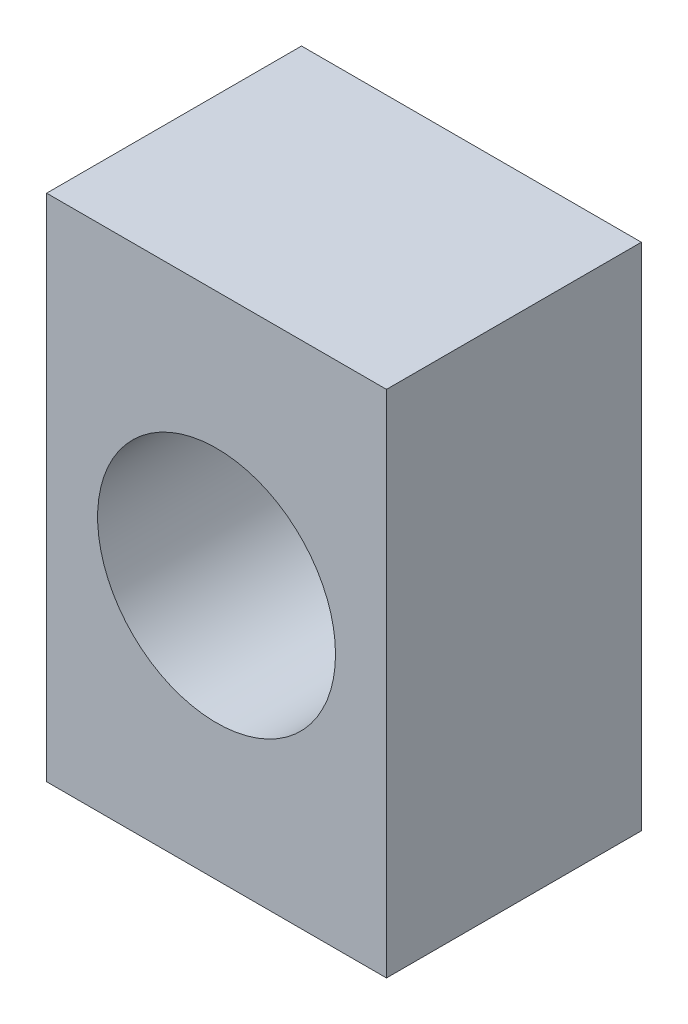
ISO-10303-21;
HEADER;
FILE_DESCRIPTION(('STEP AP214'),'2;1');
FILE_NAME('part.step','',(''),(''),'','','');
FILE_SCHEMA(('AUTOMOTIVE_DESIGN { 1 0 10303 214 1 1 1 1 }'));
ENDSEC;
DATA;
#1=APPLICATION_CONTEXT('core data for automotive mechanical design processes');
#2=APPLICATION_PROTOCOL_DEFINITION('international standard','automotive_design',2000,#1);
#3=PRODUCT_CONTEXT('',#1,'mechanical');
#4=PRODUCT('Part','Part','',(#3));
#5=PRODUCT_RELATED_PRODUCT_CATEGORY('part','',(#4));
#6=PRODUCT_DEFINITION_FORMATION('','',#4);
#7=PRODUCT_DEFINITION_CONTEXT('part definition',#1,'design');
#8=PRODUCT_DEFINITION('design','',#6,#7);
#9=PRODUCT_DEFINITION_SHAPE('','',#8);
#10=(LENGTH_UNIT() NAMED_UNIT(*) SI_UNIT(.MILLI.,.METRE.));
#11=(NAMED_UNIT(*) PLANE_ANGLE_UNIT() SI_UNIT($,.RADIAN.));
#12=(NAMED_UNIT(*) SI_UNIT($,.STERADIAN.) SOLID_ANGLE_UNIT());
#13=UNCERTAINTY_MEASURE_WITH_UNIT(LENGTH_MEASURE(1.E-05),#10,'distance_accuracy_value','');
#14=(GEOMETRIC_REPRESENTATION_CONTEXT(3) GLOBAL_UNCERTAINTY_ASSIGNED_CONTEXT((#13)) GLOBAL_UNIT_ASSIGNED_CONTEXT((#10,
#11,#12)) REPRESENTATION_CONTEXT('',''));
#15=CARTESIAN_POINT('',(0.,0.,0.));
#16=DIRECTION('',(0.,0.,1.));
#17=DIRECTION('',(1.,0.,0.));
#18=AXIS2_PLACEMENT_3D('',#15,#16,#17);
#19=CARTESIAN_POINT('',(0.,0.,27.));
#20=DIRECTION('',(0.,0.,1.));
#21=DIRECTION('',(1.,0.,0.));
#22=AXIS2_PLACEMENT_3D('',#19,#20,#21);
#23=PLANE('',#22);
#24=DIRECTION('',(-1.,0.,0.));
#25=VECTOR('',#24,1.);
#26=CARTESIAN_POINT('',(20.,30.,27.));
#27=LINE('',#26,#25);
#28=CARTESIAN_POINT('',(20.,30.,27.));
#29=VERTEX_POINT('',#28);
#30=CARTESIAN_POINT('',(-20.,30.,27.));
#31=VERTEX_POINT('',#30);
#32=EDGE_CURVE('E126',#29,#31,#27,.T.);
#33=ORIENTED_EDGE('',*,*,#32,.T.);
#34=DIRECTION('',(0.,-1.,0.));
#35=VECTOR('',#34,1.);
#36=CARTESIAN_POINT('',(-20.,30.,27.));
#37=LINE('',#36,#35);
#38=CARTESIAN_POINT('',(-20.,-30.,27.));
#39=VERTEX_POINT('',#38);
#40=EDGE_CURVE('E91',#31,#39,#37,.T.);
#41=ORIENTED_EDGE('',*,*,#40,.T.);
#42=DIRECTION('',(1.,0.,0.));
#43=VECTOR('',#42,1.);
#44=CARTESIAN_POINT('',(-20.,-30.,27.));
#45=LINE('',#44,#43);
#46=CARTESIAN_POINT('',(20.,-30.,27.));
#47=VERTEX_POINT('',#46);
#48=EDGE_CURVE('E66',#39,#47,#45,.T.);
#49=ORIENTED_EDGE('',*,*,#48,.T.);
#50=DIRECTION('',(0.,1.,0.));
#51=VECTOR('',#50,1.);
#52=CARTESIAN_POINT('',(20.,-30.,27.));
#53=LINE('',#52,#51);
#54=EDGE_CURVE('E61',#47,#29,#53,.T.);
#55=ORIENTED_EDGE('',*,*,#54,.T.);
#56=EDGE_LOOP('',(#33,#41,#49,#55));
#57=FACE_BOUND('',#56,.T.);
#58=CARTESIAN_POINT('',(0.,0.,27.));
#59=DIRECTION('',(0.,0.,1.));
#60=DIRECTION('',(1.,0.,0.));
#61=AXIS2_PLACEMENT_3D('',#58,#59,#60);
#62=CIRCLE('',#61,14.);
#63=CARTESIAN_POINT('',(14.,0.,27.));
#64=VERTEX_POINT('',#63);
#65=EDGE_CURVE('E122',#64,#64,#62,.T.);
#66=ORIENTED_EDGE('',*,*,#65,.F.);
#67=EDGE_LOOP('',(#66));
#68=FACE_BOUND('',#67,.T.);
#69=ADVANCED_FACE('F45',(#57,#68),#23,.T.);
#70=CARTESIAN_POINT('',(20.,30.,27.));
#71=DIRECTION('',(0.,-1.,0.));
#72=DIRECTION('',(0.,0.,-1.));
#73=AXIS2_PLACEMENT_3D('',#70,#71,#72);
#74=PLANE('',#73);
#75=DIRECTION('',(0.,0.,-1.));
#76=VECTOR('',#75,1.);
#77=CARTESIAN_POINT('',(20.,30.,27.));
#78=LINE('',#77,#76);
#79=CARTESIAN_POINT('',(20.,30.,-3.));
#80=VERTEX_POINT('',#79);
#81=EDGE_CURVE('E96',#29,#80,#78,.T.);
#82=ORIENTED_EDGE('',*,*,#81,.T.);
#83=DIRECTION('',(1.,0.,0.));
#84=VECTOR('',#83,1.);
#85=CARTESIAN_POINT('',(-20.,30.,-3.));
#86=LINE('',#85,#84);
#87=CARTESIAN_POINT('',(-20.,30.,-3.));
#88=VERTEX_POINT('',#87);
#89=EDGE_CURVE('E95',#88,#80,#86,.T.);
#90=ORIENTED_EDGE('',*,*,#89,.F.);
#91=DIRECTION('',(0.,0.,-1.));
#92=VECTOR('',#91,1.);
#93=CARTESIAN_POINT('',(-20.,30.,27.));
#94=LINE('',#93,#92);
#95=EDGE_CURVE('E11',#31,#88,#94,.T.);
#96=ORIENTED_EDGE('',*,*,#95,.F.);
#97=ORIENTED_EDGE('',*,*,#32,.F.);
#98=EDGE_LOOP('',(#82,#90,#96,#97));
#99=FACE_BOUND('',#98,.T.);
#100=ADVANCED_FACE('F47',(#99),#74,.F.);
#101=CARTESIAN_POINT('',(-20.,30.,27.));
#102=DIRECTION('',(1.,0.,0.));
#103=DIRECTION('',(0.,1.,0.));
#104=AXIS2_PLACEMENT_3D('',#101,#102,#103);
#105=PLANE('',#104);
#106=ORIENTED_EDGE('',*,*,#95,.T.);
#107=DIRECTION('',(0.,1.,0.));
#108=VECTOR('',#107,1.);
#109=CARTESIAN_POINT('',(-20.,-30.,-3.));
#110=LINE('',#109,#108);
#111=CARTESIAN_POINT('',(-20.,-30.,-3.));
#112=VERTEX_POINT('',#111);
#113=EDGE_CURVE('E90',#112,#88,#110,.T.);
#114=ORIENTED_EDGE('',*,*,#113,.F.);
#115=DIRECTION('',(0.,0.,-1.));
#116=VECTOR('',#115,1.);
#117=CARTESIAN_POINT('',(-20.,-30.,27.));
#118=LINE('',#117,#116);
#119=EDGE_CURVE('E54',#39,#112,#118,.T.);
#120=ORIENTED_EDGE('',*,*,#119,.F.);
#121=ORIENTED_EDGE('',*,*,#40,.F.);
#122=EDGE_LOOP('',(#106,#114,#120,#121));
#123=FACE_BOUND('',#122,.T.);
#124=ADVANCED_FACE('F87',(#123),#105,.F.);
#125=CARTESIAN_POINT('',(-20.,-30.,27.));
#126=DIRECTION('',(0.,1.,0.));
#127=DIRECTION('',(0.,0.,1.));
#128=AXIS2_PLACEMENT_3D('',#125,#126,#127);
#129=PLANE('',#128);
#130=ORIENTED_EDGE('',*,*,#119,.T.);
#131=DIRECTION('',(-1.,0.,0.));
#132=VECTOR('',#131,1.);
#133=CARTESIAN_POINT('',(20.,-30.,-3.));
#134=LINE('',#133,#132);
#135=CARTESIAN_POINT('',(20.,-30.,-3.));
#136=VERTEX_POINT('',#135);
#137=EDGE_CURVE('E107',#136,#112,#134,.T.);
#138=ORIENTED_EDGE('',*,*,#137,.F.);
#139=DIRECTION('',(0.,0.,-1.));
#140=VECTOR('',#139,1.);
#141=CARTESIAN_POINT('',(20.,-30.,27.));
#142=LINE('',#141,#140);
#143=EDGE_CURVE('E140',#47,#136,#142,.T.);
#144=ORIENTED_EDGE('',*,*,#143,.F.);
#145=ORIENTED_EDGE('',*,*,#48,.F.);
#146=EDGE_LOOP('',(#130,#138,#144,#145));
#147=FACE_BOUND('',#146,.T.);
#148=ADVANCED_FACE('F144',(#147),#129,.F.);
#149=CARTESIAN_POINT('',(20.,-30.,27.));
#150=DIRECTION('',(-1.,0.,0.));
#151=DIRECTION('',(0.,0.,1.));
#152=AXIS2_PLACEMENT_3D('',#149,#150,#151);
#153=PLANE('',#152);
#154=ORIENTED_EDGE('',*,*,#143,.T.);
#155=DIRECTION('',(0.,-1.,0.));
#156=VECTOR('',#155,1.);
#157=CARTESIAN_POINT('',(20.,30.,-3.));
#158=LINE('',#157,#156);
#159=EDGE_CURVE('E101',#80,#136,#158,.T.);
#160=ORIENTED_EDGE('',*,*,#159,.F.);
#161=ORIENTED_EDGE('',*,*,#81,.F.);
#162=ORIENTED_EDGE('',*,*,#54,.F.);
#163=EDGE_LOOP('',(#154,#160,#161,#162));
#164=FACE_BOUND('',#163,.T.);
#165=ADVANCED_FACE('F146',(#164),#153,.F.);
#166=CARTESIAN_POINT('',(0.,0.,27.));
#167=DIRECTION('',(0.,0.,-1.));
#168=DIRECTION('',(-1.,0.,0.));
#169=AXIS2_PLACEMENT_3D('',#166,#167,#168);
#170=CYLINDRICAL_SURFACE('',#169,14.);
#171=ORIENTED_EDGE('',*,*,#65,.T.);
#172=EDGE_LOOP('',(#171));
#173=FACE_BOUND('',#172,.T.);
#174=CARTESIAN_POINT('',(0.,0.,0.));
#175=DIRECTION('',(0.,0.,1.));
#176=DIRECTION('',(1.,0.,0.));
#177=AXIS2_PLACEMENT_3D('',#174,#175,#176);
#178=CIRCLE('',#177,14.);
#179=CARTESIAN_POINT('',(14.,0.,0.));
#180=VERTEX_POINT('',#179);
#181=EDGE_CURVE('E121',#180,#180,#178,.T.);
#182=ORIENTED_EDGE('',*,*,#181,.F.);
#183=EDGE_LOOP('',(#182));
#184=FACE_BOUND('',#183,.T.);
#185=ADVANCED_FACE('F152',(#173,#184),#170,.F.);
#186=CARTESIAN_POINT('',(0.,0.,0.));
#187=DIRECTION('',(0.,0.,-1.));
#188=DIRECTION('',(-1.,0.,0.));
#189=AXIS2_PLACEMENT_3D('',#186,#187,#188);
#190=PLANE('',#189);
#191=CARTESIAN_POINT('',(0.,0.,0.));
#192=DIRECTION('',(0.,0.,-1.));
#193=DIRECTION('',(-1.,0.,0.));
#194=AXIS2_PLACEMENT_3D('',#191,#192,#193);
#195=CIRCLE('',#194,13.);
#196=CARTESIAN_POINT('',(-13.,0.,0.));
#197=VERTEX_POINT('',#196);
#198=EDGE_CURVE('E113',#197,#197,#195,.T.);
#199=ORIENTED_EDGE('',*,*,#198,.T.);
#200=EDGE_LOOP('',(#199));
#201=FACE_BOUND('',#200,.T.);
#202=ORIENTED_EDGE('',*,*,#181,.T.);
#203=EDGE_LOOP('',(#202));
#204=FACE_BOUND('',#203,.T.);
#205=ADVANCED_FACE('F155',(#201,#204),#190,.F.);
#206=CARTESIAN_POINT('',(0.,0.,-3.));
#207=DIRECTION('',(0.,0.,-1.));
#208=DIRECTION('',(-1.,0.,0.));
#209=AXIS2_PLACEMENT_3D('',#206,#207,#208);
#210=PLANE('',#209);
#211=ORIENTED_EDGE('',*,*,#113,.T.);
#212=ORIENTED_EDGE('',*,*,#89,.T.);
#213=ORIENTED_EDGE('',*,*,#159,.T.);
#214=ORIENTED_EDGE('',*,*,#137,.T.);
#215=EDGE_LOOP('',(#211,#212,#213,#214));
#216=FACE_BOUND('',#215,.T.);
#217=CARTESIAN_POINT('',(0.,0.,-3.));
#218=DIRECTION('',(0.,0.,-1.));
#219=DIRECTION('',(-1.,0.,0.));
#220=AXIS2_PLACEMENT_3D('',#217,#218,#219);
#221=CIRCLE('',#220,13.);
#222=CARTESIAN_POINT('',(-13.,0.,-3.));
#223=VERTEX_POINT('',#222);
#224=EDGE_CURVE('E109',#223,#223,#221,.T.);
#225=ORIENTED_EDGE('',*,*,#224,.F.);
#226=EDGE_LOOP('',(#225));
#227=FACE_BOUND('',#226,.T.);
#228=ADVANCED_FACE('F104',(#216,#227),#210,.T.);
#229=CARTESIAN_POINT('',(0.,0.,-3.));
#230=DIRECTION('',(0.,0.,1.));
#231=DIRECTION('',(1.,0.,0.));
#232=AXIS2_PLACEMENT_3D('',#229,#230,#231);
#233=CYLINDRICAL_SURFACE('',#232,13.);
#234=ORIENTED_EDGE('',*,*,#224,.T.);
#235=EDGE_LOOP('',(#234));
#236=FACE_BOUND('',#235,.T.);
#237=ORIENTED_EDGE('',*,*,#198,.F.);
#238=EDGE_LOOP('',(#237));
#239=FACE_BOUND('',#238,.T.);
#240=ADVANCED_FACE('F166',(#236,#239),#233,.F.);
#241=CLOSED_SHELL('',(#69,#100,#124,#148,#165,#185,#205,#228,#240));
#242=MANIFOLD_SOLID_BREP('B2',#241);
#243=ADVANCED_BREP_SHAPE_REPRESENTATION('',(#18,#242),#14);
#244=SHAPE_DEFINITION_REPRESENTATION(#9,#243);
ENDSEC;
END-ISO-10303-21;
